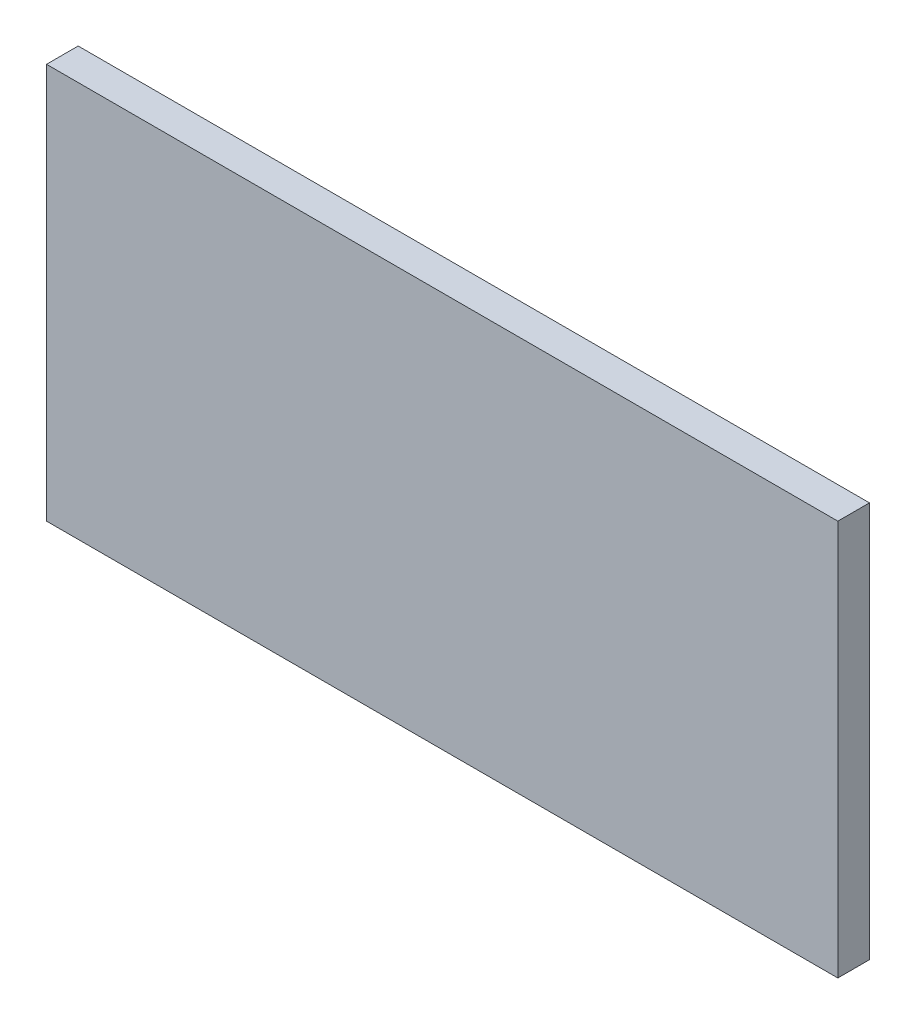
ISO-10303-21;
HEADER;
FILE_DESCRIPTION(('STEP AP214'),'2;1');
FILE_NAME('part.step','',(''),(''),'','','');
FILE_SCHEMA(('AUTOMOTIVE_DESIGN { 1 0 10303 214 1 1 1 1 }'));
ENDSEC;
DATA;
#1=APPLICATION_CONTEXT('core data for automotive mechanical design processes');
#2=APPLICATION_PROTOCOL_DEFINITION('international standard','automotive_design',2000,#1);
#3=PRODUCT_CONTEXT('',#1,'mechanical');
#4=PRODUCT('Part','Part','',(#3));
#5=PRODUCT_RELATED_PRODUCT_CATEGORY('part','',(#4));
#6=PRODUCT_DEFINITION_FORMATION('','',#4);
#7=PRODUCT_DEFINITION_CONTEXT('part definition',#1,'design');
#8=PRODUCT_DEFINITION('design','',#6,#7);
#9=PRODUCT_DEFINITION_SHAPE('','',#8);
#10=(LENGTH_UNIT() NAMED_UNIT(*) SI_UNIT(.MILLI.,.METRE.));
#11=(NAMED_UNIT(*) PLANE_ANGLE_UNIT() SI_UNIT($,.RADIAN.));
#12=(NAMED_UNIT(*) SI_UNIT($,.STERADIAN.) SOLID_ANGLE_UNIT());
#13=UNCERTAINTY_MEASURE_WITH_UNIT(LENGTH_MEASURE(1.E-05),#10,'distance_accuracy_value','');
#14=(GEOMETRIC_REPRESENTATION_CONTEXT(3) GLOBAL_UNCERTAINTY_ASSIGNED_CONTEXT((#13)) GLOBAL_UNIT_ASSIGNED_CONTEXT((#10,
#11,#12)) REPRESENTATION_CONTEXT('',''));
#15=CARTESIAN_POINT('',(0.,0.,0.));
#16=DIRECTION('',(0.,0.,1.));
#17=DIRECTION('',(1.,0.,0.));
#18=AXIS2_PLACEMENT_3D('',#15,#16,#17);
#19=CARTESIAN_POINT('',(125.,0.,10.));
#20=DIRECTION('',(-1.,0.,0.));
#21=DIRECTION('',(0.,0.,1.));
#22=AXIS2_PLACEMENT_3D('',#19,#20,#21);
#23=PLANE('',#22);
#24=DIRECTION('',(0.,1.,0.));
#25=VECTOR('',#24,1.);
#26=CARTESIAN_POINT('',(125.,0.,0.));
#27=LINE('',#26,#25);
#28=CARTESIAN_POINT('',(125.,0.,0.));
#29=VERTEX_POINT('',#28);
#30=CARTESIAN_POINT('',(125.,125.,0.));
#31=VERTEX_POINT('',#30);
#32=EDGE_CURVE('E100',#29,#31,#27,.T.);
#33=ORIENTED_EDGE('',*,*,#32,.T.);
#34=DIRECTION('',(0.,0.,-1.));
#35=VECTOR('',#34,1.);
#36=CARTESIAN_POINT('',(125.,125.,10.));
#37=LINE('',#36,#35);
#38=CARTESIAN_POINT('',(125.,125.,10.));
#39=VERTEX_POINT('',#38);
#40=EDGE_CURVE('E11',#39,#31,#37,.T.);
#41=ORIENTED_EDGE('',*,*,#40,.F.);
#42=DIRECTION('',(0.,1.,0.));
#43=VECTOR('',#42,1.);
#44=CARTESIAN_POINT('',(125.,0.,10.));
#45=LINE('',#44,#43);
#46=CARTESIAN_POINT('',(125.,0.,10.));
#47=VERTEX_POINT('',#46);
#48=EDGE_CURVE('E88',#47,#39,#45,.T.);
#49=ORIENTED_EDGE('',*,*,#48,.F.);
#50=DIRECTION('',(0.,0.,-1.));
#51=VECTOR('',#50,1.);
#52=CARTESIAN_POINT('',(125.,0.,10.));
#53=LINE('',#52,#51);
#54=EDGE_CURVE('E96',#47,#29,#53,.T.);
#55=ORIENTED_EDGE('',*,*,#54,.T.);
#56=EDGE_LOOP('',(#33,#41,#49,#55));
#57=FACE_BOUND('',#56,.T.);
#58=ADVANCED_FACE('F37',(#57),#23,.F.);
#59=CARTESIAN_POINT('',(-125.,125.,10.));
#60=DIRECTION('',(0.,-1.,0.));
#61=DIRECTION('',(0.,0.,-1.));
#62=AXIS2_PLACEMENT_3D('',#59,#60,#61);
#63=PLANE('',#62);
#64=DIRECTION('',(-1.,0.,0.));
#65=VECTOR('',#64,1.);
#66=CARTESIAN_POINT('',(-125.,125.,0.));
#67=LINE('',#66,#65);
#68=CARTESIAN_POINT('',(-125.,125.,0.));
#69=VERTEX_POINT('',#68);
#70=EDGE_CURVE('E92',#31,#69,#67,.T.);
#71=ORIENTED_EDGE('',*,*,#70,.T.);
#72=DIRECTION('',(0.,0.,-1.));
#73=VECTOR('',#72,1.);
#74=CARTESIAN_POINT('',(-125.,125.,10.));
#75=LINE('',#74,#73);
#76=CARTESIAN_POINT('',(-125.,125.,10.));
#77=VERTEX_POINT('',#76);
#78=EDGE_CURVE('E45',#77,#69,#75,.T.);
#79=ORIENTED_EDGE('',*,*,#78,.F.);
#80=DIRECTION('',(-1.,0.,0.));
#81=VECTOR('',#80,1.);
#82=CARTESIAN_POINT('',(-125.,125.,10.));
#83=LINE('',#82,#81);
#84=EDGE_CURVE('E83',#39,#77,#83,.T.);
#85=ORIENTED_EDGE('',*,*,#84,.F.);
#86=ORIENTED_EDGE('',*,*,#40,.T.);
#87=EDGE_LOOP('',(#71,#79,#85,#86));
#88=FACE_BOUND('',#87,.T.);
#89=ADVANCED_FACE('F91',(#88),#63,.F.);
#90=CARTESIAN_POINT('',(-125.,0.,10.));
#91=DIRECTION('',(1.,0.,0.));
#92=DIRECTION('',(0.,0.,-1.));
#93=AXIS2_PLACEMENT_3D('',#90,#91,#92);
#94=PLANE('',#93);
#95=DIRECTION('',(0.,-1.,0.));
#96=VECTOR('',#95,1.);
#97=CARTESIAN_POINT('',(-125.,0.,0.));
#98=LINE('',#97,#96);
#99=CARTESIAN_POINT('',(-125.,0.,0.));
#100=VERTEX_POINT('',#99);
#101=EDGE_CURVE('E70',#69,#100,#98,.T.);
#102=ORIENTED_EDGE('',*,*,#101,.T.);
#103=DIRECTION('',(0.,0.,-1.));
#104=VECTOR('',#103,1.);
#105=CARTESIAN_POINT('',(-125.,0.,10.));
#106=LINE('',#105,#104);
#107=CARTESIAN_POINT('',(-125.,0.,10.));
#108=VERTEX_POINT('',#107);
#109=EDGE_CURVE('E93',#108,#100,#106,.T.);
#110=ORIENTED_EDGE('',*,*,#109,.F.);
#111=DIRECTION('',(0.,-1.,0.));
#112=VECTOR('',#111,1.);
#113=CARTESIAN_POINT('',(-125.,0.,10.));
#114=LINE('',#113,#112);
#115=EDGE_CURVE('E86',#77,#108,#114,.T.);
#116=ORIENTED_EDGE('',*,*,#115,.F.);
#117=ORIENTED_EDGE('',*,*,#78,.T.);
#118=EDGE_LOOP('',(#102,#110,#116,#117));
#119=FACE_BOUND('',#118,.T.);
#120=ADVANCED_FACE('F94',(#119),#94,.F.);
#121=CARTESIAN_POINT('',(125.,0.,10.));
#122=DIRECTION('',(0.,1.,0.));
#123=DIRECTION('',(0.,0.,1.));
#124=AXIS2_PLACEMENT_3D('',#121,#122,#123);
#125=PLANE('',#124);
#126=DIRECTION('',(1.,0.,0.));
#127=VECTOR('',#126,1.);
#128=CARTESIAN_POINT('',(125.,0.,0.));
#129=LINE('',#128,#127);
#130=EDGE_CURVE('E76',#100,#29,#129,.T.);
#131=ORIENTED_EDGE('',*,*,#130,.T.);
#132=ORIENTED_EDGE('',*,*,#54,.F.);
#133=DIRECTION('',(1.,0.,0.));
#134=VECTOR('',#133,1.);
#135=CARTESIAN_POINT('',(125.,0.,10.));
#136=LINE('',#135,#134);
#137=EDGE_CURVE('E53',#108,#47,#136,.T.);
#138=ORIENTED_EDGE('',*,*,#137,.F.);
#139=ORIENTED_EDGE('',*,*,#109,.T.);
#140=EDGE_LOOP('',(#131,#132,#138,#139));
#141=FACE_BOUND('',#140,.T.);
#142=ADVANCED_FACE('F107',(#141),#125,.F.);
#143=CARTESIAN_POINT('',(0.,0.,10.));
#144=DIRECTION('',(0.,0.,-1.));
#145=DIRECTION('',(-1.,0.,0.));
#146=AXIS2_PLACEMENT_3D('',#143,#144,#145);
#147=PLANE('',#146);
#148=ORIENTED_EDGE('',*,*,#48,.T.);
#149=ORIENTED_EDGE('',*,*,#84,.T.);
#150=ORIENTED_EDGE('',*,*,#115,.T.);
#151=ORIENTED_EDGE('',*,*,#137,.T.);
#152=EDGE_LOOP('',(#148,#149,#150,#151));
#153=FACE_BOUND('',#152,.T.);
#154=ADVANCED_FACE('F84',(#153),#147,.F.);
#155=CARTESIAN_POINT('',(0.,0.,0.));
#156=DIRECTION('',(0.,0.,-1.));
#157=DIRECTION('',(-1.,0.,0.));
#158=AXIS2_PLACEMENT_3D('',#155,#156,#157);
#159=PLANE('',#158);
#160=ORIENTED_EDGE('',*,*,#32,.F.);
#161=ORIENTED_EDGE('',*,*,#130,.F.);
#162=ORIENTED_EDGE('',*,*,#101,.F.);
#163=ORIENTED_EDGE('',*,*,#70,.F.);
#164=EDGE_LOOP('',(#160,#161,#162,#163));
#165=FACE_BOUND('',#164,.T.);
#166=ADVANCED_FACE('F110',(#165),#159,.T.);
#167=CLOSED_SHELL('',(#58,#89,#120,#142,#154,#166));
#168=MANIFOLD_SOLID_BREP('B2',#167);
#169=ADVANCED_BREP_SHAPE_REPRESENTATION('',(#18,#168),#14);
#170=SHAPE_DEFINITION_REPRESENTATION(#9,#169);
ENDSEC;
END-ISO-10303-21;
